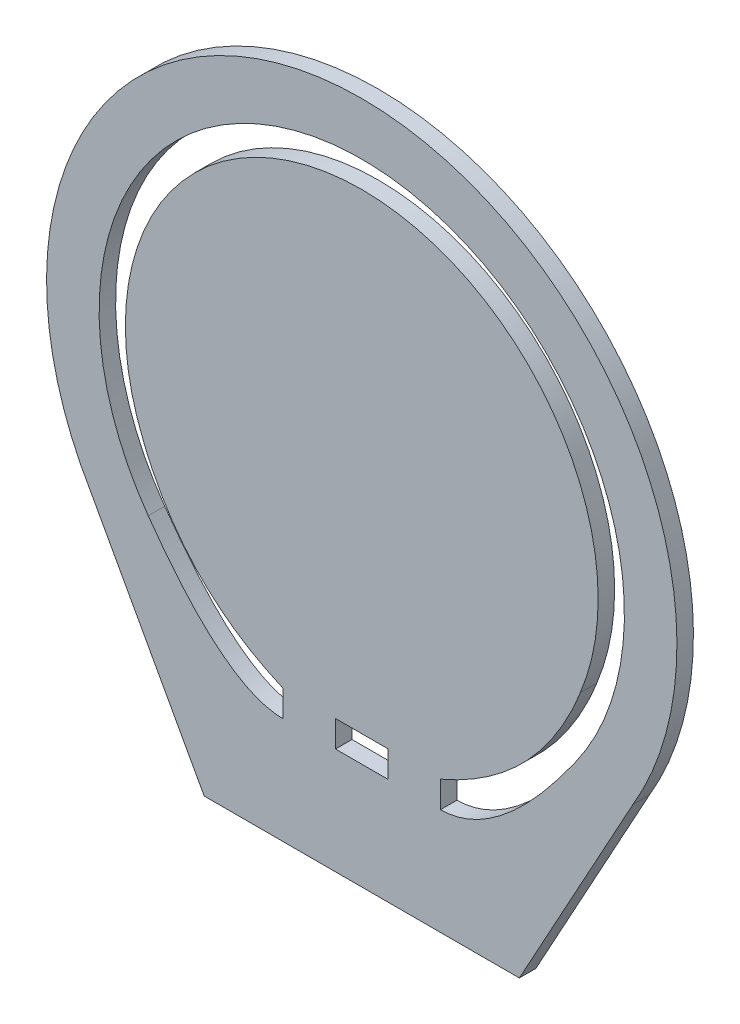
ISO-10303-21;
HEADER;
FILE_DESCRIPTION(('STEP AP214'),'2;1');
FILE_NAME('part.step','',(''),(''),'','','');
FILE_SCHEMA(('AUTOMOTIVE_DESIGN { 1 0 10303 214 1 1 1 1 }'));
ENDSEC;
DATA;
#1=APPLICATION_CONTEXT('core data for automotive mechanical design processes');
#2=APPLICATION_PROTOCOL_DEFINITION('international standard','automotive_design',2000,#1);
#3=PRODUCT_CONTEXT('',#1,'mechanical');
#4=PRODUCT('Part','Part','',(#3));
#5=PRODUCT_RELATED_PRODUCT_CATEGORY('part','',(#4));
#6=PRODUCT_DEFINITION_FORMATION('','',#4);
#7=PRODUCT_DEFINITION_CONTEXT('part definition',#1,'design');
#8=PRODUCT_DEFINITION('design','',#6,#7);
#9=PRODUCT_DEFINITION_SHAPE('','',#8);
#10=(LENGTH_UNIT() NAMED_UNIT(*) SI_UNIT(.MILLI.,.METRE.));
#11=(NAMED_UNIT(*) PLANE_ANGLE_UNIT() SI_UNIT($,.RADIAN.));
#12=(NAMED_UNIT(*) SI_UNIT($,.STERADIAN.) SOLID_ANGLE_UNIT());
#13=UNCERTAINTY_MEASURE_WITH_UNIT(LENGTH_MEASURE(1.E-05),#10,'distance_accuracy_value','');
#14=(GEOMETRIC_REPRESENTATION_CONTEXT(3) GLOBAL_UNCERTAINTY_ASSIGNED_CONTEXT((#13)) GLOBAL_UNIT_ASSIGNED_CONTEXT((#10,
#11,#12)) REPRESENTATION_CONTEXT('',''));
#15=CARTESIAN_POINT('',(0.,0.,0.));
#16=DIRECTION('',(0.,0.,1.));
#17=DIRECTION('',(1.,0.,0.));
#18=AXIS2_PLACEMENT_3D('',#15,#16,#17);
#19=CARTESIAN_POINT('',(-7.5,0.,1.57));
#20=DIRECTION('',(-1.,0.,0.));
#21=DIRECTION('',(0.,0.,1.));
#22=AXIS2_PLACEMENT_3D('',#19,#20,#21);
#23=PLANE('',#22);
#24=DIRECTION('',(0.,1.,0.));
#25=VECTOR('',#24,1.);
#26=CARTESIAN_POINT('',(-7.5,0.,1.57));
#27=LINE('',#26,#25);
#28=CARTESIAN_POINT('',(-7.5,-24.8746859276655,1.57));
#29=VERTEX_POINT('',#28);
#30=CARTESIAN_POINT('',(-7.5,-22.3606797749979,1.57));
#31=VERTEX_POINT('',#30);
#32=EDGE_CURVE('E209',#29,#31,#27,.T.);
#33=ORIENTED_EDGE('',*,*,#32,.T.);
#34=DIRECTION('',(0.,0.,1.));
#35=VECTOR('',#34,1.);
#36=CARTESIAN_POINT('',(-7.5,-22.3606797749979,0.));
#37=LINE('',#36,#35);
#38=CARTESIAN_POINT('',(-7.5,-22.3606797749979,0.));
#39=VERTEX_POINT('',#38);
#40=EDGE_CURVE('E311',#39,#31,#37,.T.);
#41=ORIENTED_EDGE('',*,*,#40,.F.);
#42=DIRECTION('',(0.,1.,0.));
#43=VECTOR('',#42,1.);
#44=CARTESIAN_POINT('',(-7.5,0.,0.));
#45=LINE('',#44,#43);
#46=CARTESIAN_POINT('',(-7.5,-24.8746859276655,0.));
#47=VERTEX_POINT('',#46);
#48=EDGE_CURVE('E196',#47,#39,#45,.T.);
#49=ORIENTED_EDGE('',*,*,#48,.F.);
#50=DIRECTION('',(0.,0.,1.));
#51=VECTOR('',#50,1.);
#52=CARTESIAN_POINT('',(-7.5,-24.8746859276655,-8.43));
#53=LINE('',#52,#51);
#54=EDGE_CURVE('E354',#47,#29,#53,.T.);
#55=ORIENTED_EDGE('',*,*,#54,.T.);
#56=EDGE_LOOP('',(#33,#41,#49,#55));
#57=FACE_BOUND('',#56,.T.);
#58=ADVANCED_FACE('F41',(#57),#23,.T.);
#59=CARTESIAN_POINT('',(0.,0.,0.));
#60=DIRECTION('',(0.,0.,1.));
#61=DIRECTION('',(1.,0.,0.));
#62=AXIS2_PLACEMENT_3D('',#59,#60,#61);
#63=CYLINDRICAL_SURFACE('',#62,22.5);
#64=DIRECTION('',(0.,0.,1.));
#65=VECTOR('',#64,1.);
#66=CARTESIAN_POINT('',(20.7954157870989,-8.590732346062,0.));
#67=LINE('',#66,#65);
#68=CARTESIAN_POINT('',(20.7954157870989,-8.590732346062,0.));
#69=VERTEX_POINT('',#68);
#70=CARTESIAN_POINT('',(20.7954157870989,-8.590732346062,1.57));
#71=VERTEX_POINT('',#70);
#72=EDGE_CURVE('E170',#69,#71,#67,.T.);
#73=ORIENTED_EDGE('',*,*,#72,.F.);
#74=CARTESIAN_POINT('',(0.,0.,0.));
#75=DIRECTION('',(0.,0.,1.));
#76=DIRECTION('',(1.,0.,0.));
#77=AXIS2_PLACEMENT_3D('',#74,#75,#76);
#78=CIRCLE('',#77,22.5);
#79=CARTESIAN_POINT('',(-20.8093248764696,-8.55698534447397,0.));
#80=VERTEX_POINT('',#79);
#81=EDGE_CURVE('E206',#69,#80,#78,.T.);
#82=ORIENTED_EDGE('',*,*,#81,.T.);
#83=DIRECTION('',(0.,0.,1.));
#84=VECTOR('',#83,1.);
#85=CARTESIAN_POINT('',(-20.8093248764696,-8.55698534447397,0.));
#86=LINE('',#85,#84);
#87=CARTESIAN_POINT('',(-20.8093248764696,-8.55698534447397,1.57));
#88=VERTEX_POINT('',#87);
#89=EDGE_CURVE('E50',#80,#88,#86,.T.);
#90=ORIENTED_EDGE('',*,*,#89,.T.);
#91=CARTESIAN_POINT('',(0.,0.,1.57));
#92=DIRECTION('',(0.,0.,1.));
#93=DIRECTION('',(1.,0.,0.));
#94=AXIS2_PLACEMENT_3D('',#91,#92,#93);
#95=CIRCLE('',#94,22.5);
#96=EDGE_CURVE('E297',#71,#88,#95,.T.);
#97=ORIENTED_EDGE('',*,*,#96,.F.);
#98=EDGE_LOOP('',(#73,#82,#90,#97));
#99=FACE_BOUND('',#98,.T.);
#100=ADVANCED_FACE('F296',(#99),#63,.T.);
#101=CARTESIAN_POINT('',(0.,0.,1.57));
#102=DIRECTION('',(0.,0.,-1.));
#103=DIRECTION('',(-1.,0.,0.));
#104=AXIS2_PLACEMENT_3D('',#101,#102,#103);
#105=CYLINDRICAL_SURFACE('',#104,25.);
#106=DIRECTION('',(0.,0.,1.));
#107=VECTOR('',#106,1.);
#108=CARTESIAN_POINT('',(-20.3234569449401,-14.558746436667,-8.43));
#109=LINE('',#108,#107);
#110=CARTESIAN_POINT('',(-20.3234569449401,-14.558746436667,0.));
#111=VERTEX_POINT('',#110);
#112=CARTESIAN_POINT('',(-20.3234569449401,-14.558746436667,1.57));
#113=VERTEX_POINT('',#112);
#114=EDGE_CURVE('E352',#111,#113,#109,.T.);
#115=ORIENTED_EDGE('',*,*,#114,.F.);
#116=CARTESIAN_POINT('',(0.,0.,0.));
#117=DIRECTION('',(0.,0.,1.));
#118=DIRECTION('',(1.,0.,0.));
#119=AXIS2_PLACEMENT_3D('',#116,#117,#118);
#120=CIRCLE('',#119,25.);
#121=CARTESIAN_POINT('',(20.3234569449401,-14.558746436667,0.));
#122=VERTEX_POINT('',#121);
#123=EDGE_CURVE('E245',#122,#111,#120,.T.);
#124=ORIENTED_EDGE('',*,*,#123,.F.);
#125=DIRECTION('',(0.,0.,1.));
#126=VECTOR('',#125,1.);
#127=CARTESIAN_POINT('',(20.3234569449401,-14.558746436667,-8.43));
#128=LINE('',#127,#126);
#129=CARTESIAN_POINT('',(20.3234569449401,-14.558746436667,1.57));
#130=VERTEX_POINT('',#129);
#131=EDGE_CURVE('E374',#122,#130,#128,.T.);
#132=ORIENTED_EDGE('',*,*,#131,.T.);
#133=CARTESIAN_POINT('',(0.,0.,1.57));
#134=DIRECTION('',(0.,0.,1.));
#135=DIRECTION('',(1.,0.,0.));
#136=AXIS2_PLACEMENT_3D('',#133,#134,#135);
#137=CIRCLE('',#136,25.);
#138=EDGE_CURVE('E254',#130,#113,#137,.T.);
#139=ORIENTED_EDGE('',*,*,#138,.T.);
#140=EDGE_LOOP('',(#115,#124,#132,#139));
#141=FACE_BOUND('',#140,.T.);
#142=ADVANCED_FACE('F403',(#141),#105,.F.);
#143=CARTESIAN_POINT('',(0.,0.,1.57));
#144=DIRECTION('',(0.,0.,1.));
#145=DIRECTION('',(1.,0.,0.));
#146=AXIS2_PLACEMENT_3D('',#143,#144,#145);
#147=PLANE('',#146);
#148=CARTESIAN_POINT('',(7.49959007406008,-22.3602867896569,1.57));
#149=CARTESIAN_POINT('',(17.9758604776921,-17.8786187370047,1.57));
#150=CARTESIAN_POINT('',(21.5732382094817,-6.38926319703825,1.57));
#151=B_SPLINE_CURVE_WITH_KNOTS('',2,(#148,#149,#150),.UNSPECIFIED.,.F.,.F.,(3,3),(0.,1.),.UNSPECIFIED.);
#152=CARTESIAN_POINT('',(7.50000000027932,-22.3601114225585,1.57));
#153=VERTEX_POINT('',#152);
#154=EDGE_CURVE('E166',#153,#71,#151,.T.);
#155=ORIENTED_EDGE('',*,*,#154,.T.);
#156=ORIENTED_EDGE('',*,*,#96,.T.);
#157=CARTESIAN_POINT('',(-7.5,-22.3606797749979,1.57));
#158=CARTESIAN_POINT('',(-17.976270403632,-17.8790117223457,1.57));
#159=CARTESIAN_POINT('',(-21.5736481354217,-6.38965618237926,1.57));
#160=B_SPLINE_CURVE_WITH_KNOTS('',2,(#157,#158,#159),.UNSPECIFIED.,.F.,.F.,(3,3),(0.,1.),.UNSPECIFIED.);
#161=EDGE_CURVE('E306',#31,#88,#160,.T.);
#162=ORIENTED_EDGE('',*,*,#161,.F.);
#163=ORIENTED_EDGE('',*,*,#32,.F.);
#164=CARTESIAN_POINT('',(-20.3234569449403,-14.5587464366668,1.57));
#165=CARTESIAN_POINT('',(-13.043190102568,-24.8746859276655,1.57));
#166=CARTESIAN_POINT('',(-7.5,-24.8746859276655,1.57));
#167=B_SPLINE_CURVE_WITH_KNOTS('',2,(#164,#165,#166),.UNSPECIFIED.,.F.,.F.,(3,3),(0.,1.),.UNSPECIFIED.);
#168=EDGE_CURVE('E343',#113,#29,#167,.T.);
#169=ORIENTED_EDGE('',*,*,#168,.F.);
#170=ORIENTED_EDGE('',*,*,#138,.F.);
#171=CARTESIAN_POINT('',(20.3234569449403,-14.5587464366668,1.57));
#172=CARTESIAN_POINT('',(13.043190102568,-24.8746859276655,1.57));
#173=CARTESIAN_POINT('',(7.5,-24.8746859276655,1.57));
#174=B_SPLINE_CURVE_WITH_KNOTS('',2,(#171,#172,#173),.UNSPECIFIED.,.F.,.F.,(3,3),(0.,1.),.UNSPECIFIED.);
#175=CARTESIAN_POINT('',(7.5,-24.8746859276655,1.57));
#176=VERTEX_POINT('',#175);
#177=EDGE_CURVE('E188',#130,#176,#174,.T.);
#178=ORIENTED_EDGE('',*,*,#177,.T.);
#179=DIRECTION('',(0.,1.,0.));
#180=VECTOR('',#179,1.);
#181=CARTESIAN_POINT('',(7.5,0.,1.57));
#182=LINE('',#181,#180);
#183=EDGE_CURVE('E181',#176,#153,#182,.T.);
#184=ORIENTED_EDGE('',*,*,#183,.T.);
#185=EDGE_LOOP('',(#155,#156,#162,#163,#169,#170,#178,#184));
#186=FACE_BOUND('',#185,.T.);
#187=DIRECTION('',(0.,1.,0.));
#188=VECTOR('',#187,1.);
#189=CARTESIAN_POINT('',(-2.5,0.,1.57));
#190=LINE('',#189,#188);
#191=CARTESIAN_POINT('',(-2.5,-24.8746859276655,1.57));
#192=VERTEX_POINT('',#191);
#193=CARTESIAN_POINT('',(-2.5,-22.3606797749979,1.57));
#194=VERTEX_POINT('',#193);
#195=EDGE_CURVE('E213',#192,#194,#190,.T.);
#196=ORIENTED_EDGE('',*,*,#195,.T.);
#197=DIRECTION('',(-1.,0.,0.));
#198=VECTOR('',#197,1.);
#199=CARTESIAN_POINT('',(-2.5,-22.3606797749979,1.57));
#200=LINE('',#199,#198);
#201=CARTESIAN_POINT('',(2.5,-22.3606797749979,1.57));
#202=VERTEX_POINT('',#201);
#203=EDGE_CURVE('E361',#202,#194,#200,.T.);
#204=ORIENTED_EDGE('',*,*,#203,.F.);
#205=DIRECTION('',(0.,1.,0.));
#206=VECTOR('',#205,1.);
#207=CARTESIAN_POINT('',(2.5,0.,1.57));
#208=LINE('',#207,#206);
#209=CARTESIAN_POINT('',(2.5,-24.8746859276655,1.57));
#210=VERTEX_POINT('',#209);
#211=EDGE_CURVE('E191',#210,#202,#208,.T.);
#212=ORIENTED_EDGE('',*,*,#211,.F.);
#213=DIRECTION('',(-1.,0.,0.));
#214=VECTOR('',#213,1.);
#215=CARTESIAN_POINT('',(2.5,-24.8746859276655,1.57));
#216=LINE('',#215,#214);
#217=EDGE_CURVE('E387',#210,#192,#216,.T.);
#218=ORIENTED_EDGE('',*,*,#217,.T.);
#219=EDGE_LOOP('',(#196,#204,#212,#218));
#220=FACE_BOUND('',#219,.T.);
#221=CARTESIAN_POINT('',(0.,0.,1.57));
#222=DIRECTION('',(0.,0.,1.));
#223=DIRECTION('',(1.,0.,0.));
#224=AXIS2_PLACEMENT_3D('',#221,#222,#223);
#225=CIRCLE('',#224,30.);
#226=CARTESIAN_POINT('',(25.8005366625301,-15.3079165115779,1.57));
#227=VERTEX_POINT('',#226);
#228=CARTESIAN_POINT('',(-25.8005366625302,-15.3079165115778,1.57));
#229=VERTEX_POINT('',#228);
#230=EDGE_CURVE('E262',#227,#229,#225,.T.);
#231=ORIENTED_EDGE('',*,*,#230,.T.);
#232=DIRECTION('',(-0.480889164745887,0.876781393067852,0.));
#233=VECTOR('',#232,1.);
#234=CARTESIAN_POINT('',(-26.2883976806498,-14.4184236836069,1.57));
#235=LINE('',#234,#233);
#236=CARTESIAN_POINT('',(-15.,-35.,1.57));
#237=VERTEX_POINT('',#236);
#238=EDGE_CURVE('E84',#237,#229,#235,.T.);
#239=ORIENTED_EDGE('',*,*,#238,.F.);
#240=DIRECTION('',(1.,0.,0.));
#241=VECTOR('',#240,1.);
#242=CARTESIAN_POINT('',(0.,-35.,1.57));
#243=LINE('',#242,#241);
#244=CARTESIAN_POINT('',(15.,-35.,1.57));
#245=VERTEX_POINT('',#244);
#246=EDGE_CURVE('E237',#237,#245,#243,.T.);
#247=ORIENTED_EDGE('',*,*,#246,.T.);
#248=DIRECTION('',(0.480889164745886,0.876781393067852,0.));
#249=VECTOR('',#248,1.);
#250=CARTESIAN_POINT('',(26.2883976806498,-14.4184236836069,1.57));
#251=LINE('',#250,#249);
#252=EDGE_CURVE('E57',#245,#227,#251,.T.);
#253=ORIENTED_EDGE('',*,*,#252,.T.);
#254=EDGE_LOOP('',(#231,#239,#247,#253));
#255=FACE_BOUND('',#254,.T.);
#256=ADVANCED_FACE('F185',(#186,#220,#255),#147,.T.);
#257=CARTESIAN_POINT('',(0.,0.,0.));
#258=DIRECTION('',(0.,0.,1.));
#259=DIRECTION('',(1.,0.,0.));
#260=AXIS2_PLACEMENT_3D('',#257,#258,#259);
#261=PLANE('',#260);
#262=ORIENTED_EDGE('',*,*,#81,.F.);
#263=CARTESIAN_POINT('',(7.49959007406008,-22.3602867896569,0.));
#264=CARTESIAN_POINT('',(17.9758604776921,-17.8786187370047,0.));
#265=CARTESIAN_POINT('',(21.5732382094817,-6.38926319703825,0.));
#266=B_SPLINE_CURVE_WITH_KNOTS('',2,(#263,#264,#265),.UNSPECIFIED.,.F.,.F.,(3,3),(0.,1.),.UNSPECIFIED.);
#267=CARTESIAN_POINT('',(7.50000000027932,-22.3601114225585,0.));
#268=VERTEX_POINT('',#267);
#269=EDGE_CURVE('E175',#268,#69,#266,.T.);
#270=ORIENTED_EDGE('',*,*,#269,.F.);
#271=DIRECTION('',(0.,1.,0.));
#272=VECTOR('',#271,1.);
#273=CARTESIAN_POINT('',(7.5,0.,0.));
#274=LINE('',#273,#272);
#275=CARTESIAN_POINT('',(7.5,-24.8746859276655,0.));
#276=VERTEX_POINT('',#275);
#277=EDGE_CURVE('E183',#276,#268,#274,.T.);
#278=ORIENTED_EDGE('',*,*,#277,.F.);
#279=CARTESIAN_POINT('',(20.3234569449403,-14.5587464366668,0.));
#280=CARTESIAN_POINT('',(13.043190102568,-24.8746859276655,0.));
#281=CARTESIAN_POINT('',(7.5,-24.8746859276655,0.));
#282=B_SPLINE_CURVE_WITH_KNOTS('',2,(#279,#280,#281),.UNSPECIFIED.,.F.,.F.,(3,3),(0.,1.),.UNSPECIFIED.);
#283=EDGE_CURVE('E275',#122,#276,#282,.T.);
#284=ORIENTED_EDGE('',*,*,#283,.F.);
#285=ORIENTED_EDGE('',*,*,#123,.T.);
#286=CARTESIAN_POINT('',(-20.3234569449403,-14.5587464366668,0.));
#287=CARTESIAN_POINT('',(-13.043190102568,-24.8746859276655,0.));
#288=CARTESIAN_POINT('',(-7.5,-24.8746859276655,0.));
#289=B_SPLINE_CURVE_WITH_KNOTS('',2,(#286,#287,#288),.UNSPECIFIED.,.F.,.F.,(3,3),(0.,1.),.UNSPECIFIED.);
#290=EDGE_CURVE('E281',#111,#47,#289,.T.);
#291=ORIENTED_EDGE('',*,*,#290,.T.);
#292=ORIENTED_EDGE('',*,*,#48,.T.);
#293=CARTESIAN_POINT('',(-7.5,-22.3606797749979,0.));
#294=CARTESIAN_POINT('',(-17.976270403632,-17.8790117223457,0.));
#295=CARTESIAN_POINT('',(-21.5736481354217,-6.38965618237926,0.));
#296=B_SPLINE_CURVE_WITH_KNOTS('',2,(#293,#294,#295),.UNSPECIFIED.,.F.,.F.,(3,3),(0.,1.),.UNSPECIFIED.);
#297=EDGE_CURVE('E303',#39,#80,#296,.T.);
#298=ORIENTED_EDGE('',*,*,#297,.T.);
#299=EDGE_LOOP('',(#262,#270,#278,#284,#285,#291,#292,#298));
#300=FACE_BOUND('',#299,.T.);
#301=DIRECTION('',(-1.,0.,0.));
#302=VECTOR('',#301,1.);
#303=CARTESIAN_POINT('',(-2.5,-22.3606797749979,0.));
#304=LINE('',#303,#302);
#305=CARTESIAN_POINT('',(2.5,-22.3606797749979,0.));
#306=VERTEX_POINT('',#305);
#307=CARTESIAN_POINT('',(-2.5,-22.3606797749979,0.));
#308=VERTEX_POINT('',#307);
#309=EDGE_CURVE('E383',#306,#308,#304,.T.);
#310=ORIENTED_EDGE('',*,*,#309,.T.);
#311=DIRECTION('',(0.,1.,0.));
#312=VECTOR('',#311,1.);
#313=CARTESIAN_POINT('',(-2.5,0.,0.));
#314=LINE('',#313,#312);
#315=CARTESIAN_POINT('',(-2.5,-24.8746859276655,0.));
#316=VERTEX_POINT('',#315);
#317=EDGE_CURVE('E214',#316,#308,#314,.T.);
#318=ORIENTED_EDGE('',*,*,#317,.F.);
#319=DIRECTION('',(-1.,0.,0.));
#320=VECTOR('',#319,1.);
#321=CARTESIAN_POINT('',(2.5,-24.8746859276655,0.));
#322=LINE('',#321,#320);
#323=CARTESIAN_POINT('',(2.5,-24.8746859276655,0.));
#324=VERTEX_POINT('',#323);
#325=EDGE_CURVE('E390',#324,#316,#322,.T.);
#326=ORIENTED_EDGE('',*,*,#325,.F.);
#327=DIRECTION('',(0.,1.,0.));
#328=VECTOR('',#327,1.);
#329=CARTESIAN_POINT('',(2.5,0.,0.));
#330=LINE('',#329,#328);
#331=EDGE_CURVE('E202',#324,#306,#330,.T.);
#332=ORIENTED_EDGE('',*,*,#331,.T.);
#333=EDGE_LOOP('',(#310,#318,#326,#332));
#334=FACE_BOUND('',#333,.T.);
#335=CARTESIAN_POINT('',(0.,0.,0.));
#336=DIRECTION('',(0.,0.,1.));
#337=DIRECTION('',(1.,0.,0.));
#338=AXIS2_PLACEMENT_3D('',#335,#336,#337);
#339=CIRCLE('',#338,30.);
#340=CARTESIAN_POINT('',(25.8005366625301,-15.3079165115779,0.));
#341=VERTEX_POINT('',#340);
#342=CARTESIAN_POINT('',(-25.8005366625302,-15.3079165115778,0.));
#343=VERTEX_POINT('',#342);
#344=EDGE_CURVE('E258',#341,#343,#339,.T.);
#345=ORIENTED_EDGE('',*,*,#344,.F.);
#346=DIRECTION('',(0.480889164745886,0.876781393067852,0.));
#347=VECTOR('',#346,1.);
#348=CARTESIAN_POINT('',(26.2883976806498,-14.4184236836069,0.));
#349=LINE('',#348,#347);
#350=CARTESIAN_POINT('',(15.,-35.,0.));
#351=VERTEX_POINT('',#350);
#352=EDGE_CURVE('E232',#351,#341,#349,.T.);
#353=ORIENTED_EDGE('',*,*,#352,.F.);
#354=DIRECTION('',(1.,0.,0.));
#355=VECTOR('',#354,1.);
#356=CARTESIAN_POINT('',(0.,-35.,0.));
#357=LINE('',#356,#355);
#358=CARTESIAN_POINT('',(-15.,-35.,0.));
#359=VERTEX_POINT('',#358);
#360=EDGE_CURVE('E229',#359,#351,#357,.T.);
#361=ORIENTED_EDGE('',*,*,#360,.F.);
#362=DIRECTION('',(-0.480889164745887,0.876781393067852,0.));
#363=VECTOR('',#362,1.);
#364=CARTESIAN_POINT('',(-26.2883976806498,-14.4184236836069,0.));
#365=LINE('',#364,#363);
#366=EDGE_CURVE('E66',#359,#343,#365,.T.);
#367=ORIENTED_EDGE('',*,*,#366,.T.);
#368=EDGE_LOOP('',(#345,#353,#361,#367));
#369=FACE_BOUND('',#368,.T.);
#370=ADVANCED_FACE('F308',(#300,#334,#369),#261,.F.);
#371=CARTESIAN_POINT('',(0.,0.,1.57));
#372=DIRECTION('',(0.,0.,-1.));
#373=DIRECTION('',(-1.,0.,0.));
#374=AXIS2_PLACEMENT_3D('',#371,#372,#373);
#375=CYLINDRICAL_SURFACE('',#374,30.);
#376=DIRECTION('',(0.,0.,1.));
#377=VECTOR('',#376,1.);
#378=CARTESIAN_POINT('',(-25.8005366625302,-15.3079165115778,0.));
#379=LINE('',#378,#377);
#380=EDGE_CURVE('E242',#343,#229,#379,.T.);
#381=ORIENTED_EDGE('',*,*,#380,.T.);
#382=ORIENTED_EDGE('',*,*,#230,.F.);
#383=DIRECTION('',(0.,0.,1.));
#384=VECTOR('',#383,1.);
#385=CARTESIAN_POINT('',(25.8005366625301,-15.3079165115779,0.));
#386=LINE('',#385,#384);
#387=EDGE_CURVE('E246',#341,#227,#386,.T.);
#388=ORIENTED_EDGE('',*,*,#387,.F.);
#389=ORIENTED_EDGE('',*,*,#344,.T.);
#390=EDGE_LOOP('',(#381,#382,#388,#389));
#391=FACE_BOUND('',#390,.T.);
#392=ADVANCED_FACE('F43',(#391),#375,.T.);
#393=CARTESIAN_POINT('',(-26.2883976806498,-14.4184236836069,0.));
#394=DIRECTION('',(0.876781393067852,0.480889164745887,0.));
#395=DIRECTION('',(-0.480889164745887,0.876781393067852,0.));
#396=AXIS2_PLACEMENT_3D('',#393,#394,#395);
#397=PLANE('',#396);
#398=ORIENTED_EDGE('',*,*,#238,.T.);
#399=ORIENTED_EDGE('',*,*,#380,.F.);
#400=ORIENTED_EDGE('',*,*,#366,.F.);
#401=DIRECTION('',(0.,0.,1.));
#402=VECTOR('',#401,1.);
#403=CARTESIAN_POINT('',(-15.,-35.,0.));
#404=LINE('',#403,#402);
#405=EDGE_CURVE('E91',#359,#237,#404,.T.);
#406=ORIENTED_EDGE('',*,*,#405,.T.);
#407=EDGE_LOOP('',(#398,#399,#400,#406));
#408=FACE_BOUND('',#407,.T.);
#409=ADVANCED_FACE('F441',(#408),#397,.F.);
#410=CARTESIAN_POINT('',(26.2883976806498,-14.4184236836069,0.));
#411=DIRECTION('',(0.876781393067852,-0.480889164745886,0.));
#412=DIRECTION('',(0.480889164745886,0.876781393067852,0.));
#413=AXIS2_PLACEMENT_3D('',#410,#411,#412);
#414=PLANE('',#413);
#415=ORIENTED_EDGE('',*,*,#252,.F.);
#416=DIRECTION('',(0.,0.,1.));
#417=VECTOR('',#416,1.);
#418=CARTESIAN_POINT('',(15.,-35.,0.));
#419=LINE('',#418,#417);
#420=EDGE_CURVE('E249',#351,#245,#419,.T.);
#421=ORIENTED_EDGE('',*,*,#420,.F.);
#422=ORIENTED_EDGE('',*,*,#352,.T.);
#423=ORIENTED_EDGE('',*,*,#387,.T.);
#424=EDGE_LOOP('',(#415,#421,#422,#423));
#425=FACE_BOUND('',#424,.T.);
#426=ADVANCED_FACE('F437',(#425),#414,.T.);
#427=CARTESIAN_POINT('',(0.,-35.,0.));
#428=DIRECTION('',(0.,-1.,0.));
#429=DIRECTION('',(0.,0.,-1.));
#430=AXIS2_PLACEMENT_3D('',#427,#428,#429);
#431=PLANE('',#430);
#432=ORIENTED_EDGE('',*,*,#246,.F.);
#433=ORIENTED_EDGE('',*,*,#405,.F.);
#434=ORIENTED_EDGE('',*,*,#360,.T.);
#435=ORIENTED_EDGE('',*,*,#420,.T.);
#436=EDGE_LOOP('',(#432,#433,#434,#435));
#437=FACE_BOUND('',#436,.T.);
#438=ADVANCED_FACE('F440',(#437),#431,.T.);
#439=CARTESIAN_POINT('',(-2.5,0.,1.57));
#440=DIRECTION('',(-1.,0.,0.));
#441=DIRECTION('',(0.,0.,1.));
#442=AXIS2_PLACEMENT_3D('',#439,#440,#441);
#443=PLANE('',#442);
#444=DIRECTION('',(0.,0.,-1.));
#445=VECTOR('',#444,1.);
#446=CARTESIAN_POINT('',(-2.5,-24.8746859276655,1.57));
#447=LINE('',#446,#445);
#448=EDGE_CURVE('E265',#316,#192,#447,.F.);
#449=ORIENTED_EDGE('',*,*,#448,.F.);
#450=ORIENTED_EDGE('',*,*,#317,.T.);
#451=DIRECTION('',(0.,0.,-1.));
#452=VECTOR('',#451,1.);
#453=CARTESIAN_POINT('',(-2.5,-22.3606797749979,1.57));
#454=LINE('',#453,#452);
#455=EDGE_CURVE('E218',#194,#308,#454,.T.);
#456=ORIENTED_EDGE('',*,*,#455,.F.);
#457=ORIENTED_EDGE('',*,*,#195,.F.);
#458=EDGE_LOOP('',(#449,#450,#456,#457));
#459=FACE_BOUND('',#458,.T.);
#460=ADVANCED_FACE('F435',(#459),#443,.F.);
#461=CARTESIAN_POINT('',(2.5,0.,1.57));
#462=DIRECTION('',(-1.,0.,0.));
#463=DIRECTION('',(0.,0.,1.));
#464=AXIS2_PLACEMENT_3D('',#461,#462,#463);
#465=PLANE('',#464);
#466=ORIENTED_EDGE('',*,*,#331,.F.);
#467=DIRECTION('',(0.,0.,-1.));
#468=VECTOR('',#467,1.);
#469=CARTESIAN_POINT('',(2.5,-24.8746859276655,1.57));
#470=LINE('',#469,#468);
#471=EDGE_CURVE('E271',#324,#210,#470,.F.);
#472=ORIENTED_EDGE('',*,*,#471,.T.);
#473=ORIENTED_EDGE('',*,*,#211,.T.);
#474=DIRECTION('',(0.,0.,-1.));
#475=VECTOR('',#474,1.);
#476=CARTESIAN_POINT('',(2.5,-22.3606797749979,1.57));
#477=LINE('',#476,#475);
#478=EDGE_CURVE('E190',#202,#306,#477,.T.);
#479=ORIENTED_EDGE('',*,*,#478,.T.);
#480=EDGE_LOOP('',(#466,#472,#473,#479));
#481=FACE_BOUND('',#480,.T.);
#482=ADVANCED_FACE('F479',(#481),#465,.T.);
#483=CARTESIAN_POINT('',(7.5,0.,1.57));
#484=DIRECTION('',(-1.,0.,0.));
#485=DIRECTION('',(0.,0.,1.));
#486=AXIS2_PLACEMENT_3D('',#483,#484,#485);
#487=PLANE('',#486);
#488=ORIENTED_EDGE('',*,*,#277,.T.);
#489=DIRECTION('',(0.,0.,1.));
#490=VECTOR('',#489,1.);
#491=CARTESIAN_POINT('',(7.5,-22.360111422678,0.));
#492=LINE('',#491,#490);
#493=EDGE_CURVE('E11',#268,#153,#492,.T.);
#494=ORIENTED_EDGE('',*,*,#493,.T.);
#495=ORIENTED_EDGE('',*,*,#183,.F.);
#496=DIRECTION('',(0.,0.,1.));
#497=VECTOR('',#496,1.);
#498=CARTESIAN_POINT('',(7.5,-24.8746859276655,-8.43));
#499=LINE('',#498,#497);
#500=EDGE_CURVE('E353',#276,#176,#499,.T.);
#501=ORIENTED_EDGE('',*,*,#500,.F.);
#502=EDGE_LOOP('',(#488,#494,#495,#501));
#503=FACE_BOUND('',#502,.T.);
#504=ADVANCED_FACE('F179',(#503),#487,.F.);
#505=CARTESIAN_POINT('',(2.5,-24.8746859276655,0.));
#506=DIRECTION('',(0.,1.,0.));
#507=DIRECTION('',(0.,0.,1.));
#508=AXIS2_PLACEMENT_3D('',#505,#506,#507);
#509=PLANE('',#508);
#510=ORIENTED_EDGE('',*,*,#217,.F.);
#511=ORIENTED_EDGE('',*,*,#471,.F.);
#512=ORIENTED_EDGE('',*,*,#325,.T.);
#513=ORIENTED_EDGE('',*,*,#448,.T.);
#514=EDGE_LOOP('',(#510,#511,#512,#513));
#515=FACE_BOUND('',#514,.T.);
#516=ADVANCED_FACE('F425',(#515),#509,.T.);
#517=CARTESIAN_POINT('',(-2.5,-22.3606797749979,0.));
#518=DIRECTION('',(0.,1.,0.));
#519=DIRECTION('',(0.,0.,1.));
#520=AXIS2_PLACEMENT_3D('',#517,#518,#519);
#521=PLANE('',#520);
#522=ORIENTED_EDGE('',*,*,#203,.T.);
#523=ORIENTED_EDGE('',*,*,#455,.T.);
#524=ORIENTED_EDGE('',*,*,#309,.F.);
#525=ORIENTED_EDGE('',*,*,#478,.F.);
#526=EDGE_LOOP('',(#522,#523,#524,#525));
#527=FACE_BOUND('',#526,.T.);
#528=ADVANCED_FACE('F421',(#527),#521,.F.);
#529=CARTESIAN_POINT('',(20.3234569449403,-14.5587464366668,-8.43));
#530=CARTESIAN_POINT('',(13.043190102568,-24.8746859276655,-8.43));
#531=CARTESIAN_POINT('',(7.5,-24.8746859276655,-8.43));
#532=B_SPLINE_CURVE_WITH_KNOTS('',2,(#529,#530,#531),.UNSPECIFIED.,.F.,.F.,(3,3),(0.,1.),.UNSPECIFIED.);
#533=DIRECTION('',(0.,0.,1.));
#534=VECTOR('',#533,1.);
#535=SURFACE_OF_LINEAR_EXTRUSION('',#532,#534);
#536=ORIENTED_EDGE('',*,*,#283,.T.);
#537=ORIENTED_EDGE('',*,*,#500,.T.);
#538=ORIENTED_EDGE('',*,*,#177,.F.);
#539=ORIENTED_EDGE('',*,*,#131,.F.);
#540=EDGE_LOOP('',(#536,#537,#538,#539));
#541=FACE_BOUND('',#540,.T.);
#542=ADVANCED_FACE('F335',(#541),#535,.T.);
#543=CARTESIAN_POINT('',(-20.3234569449403,-14.5587464366668,-8.43));
#544=CARTESIAN_POINT('',(-13.043190102568,-24.8746859276655,-8.43));
#545=CARTESIAN_POINT('',(-7.5,-24.8746859276655,-8.43));
#546=B_SPLINE_CURVE_WITH_KNOTS('',2,(#543,#544,#545),.UNSPECIFIED.,.F.,.F.,(3,3),(0.,1.),.UNSPECIFIED.);
#547=DIRECTION('',(0.,0.,1.));
#548=VECTOR('',#547,1.);
#549=SURFACE_OF_LINEAR_EXTRUSION('',#546,#548);
#550=ORIENTED_EDGE('',*,*,#114,.T.);
#551=ORIENTED_EDGE('',*,*,#168,.T.);
#552=ORIENTED_EDGE('',*,*,#54,.F.);
#553=ORIENTED_EDGE('',*,*,#290,.F.);
#554=EDGE_LOOP('',(#550,#551,#552,#553));
#555=FACE_BOUND('',#554,.T.);
#556=ADVANCED_FACE('F330',(#555),#549,.F.);
#557=DIRECTION('',(0.,0.,1.));
#558=VECTOR('',#557,1.);
#559=SURFACE_OF_LINEAR_EXTRUSION('',#296,#558);
#560=ORIENTED_EDGE('',*,*,#89,.F.);
#561=ORIENTED_EDGE('',*,*,#297,.F.);
#562=ORIENTED_EDGE('',*,*,#40,.T.);
#563=ORIENTED_EDGE('',*,*,#161,.T.);
#564=EDGE_LOOP('',(#560,#561,#562,#563));
#565=FACE_BOUND('',#564,.T.);
#566=ADVANCED_FACE('F302',(#565),#559,.F.);
#567=DIRECTION('',(0.,0.,1.));
#568=VECTOR('',#567,1.);
#569=SURFACE_OF_LINEAR_EXTRUSION('',#266,#568);
#570=ORIENTED_EDGE('',*,*,#269,.T.);
#571=ORIENTED_EDGE('',*,*,#72,.T.);
#572=ORIENTED_EDGE('',*,*,#154,.F.);
#573=ORIENTED_EDGE('',*,*,#493,.F.);
#574=EDGE_LOOP('',(#570,#571,#572,#573));
#575=FACE_BOUND('',#574,.T.);
#576=ADVANCED_FACE('F167',(#575),#569,.T.);
#577=CLOSED_SHELL('',(#58,#100,#142,#256,#370,#392,#409,#426,#438,#460,#482,#504,#516,#528,#542,
#556,#566,#576));
#578=MANIFOLD_SOLID_BREP('B2',#577);
#579=ADVANCED_BREP_SHAPE_REPRESENTATION('',(#18,#578),#14);
#580=SHAPE_DEFINITION_REPRESENTATION(#9,#579);
ENDSEC;
END-ISO-10303-21;
